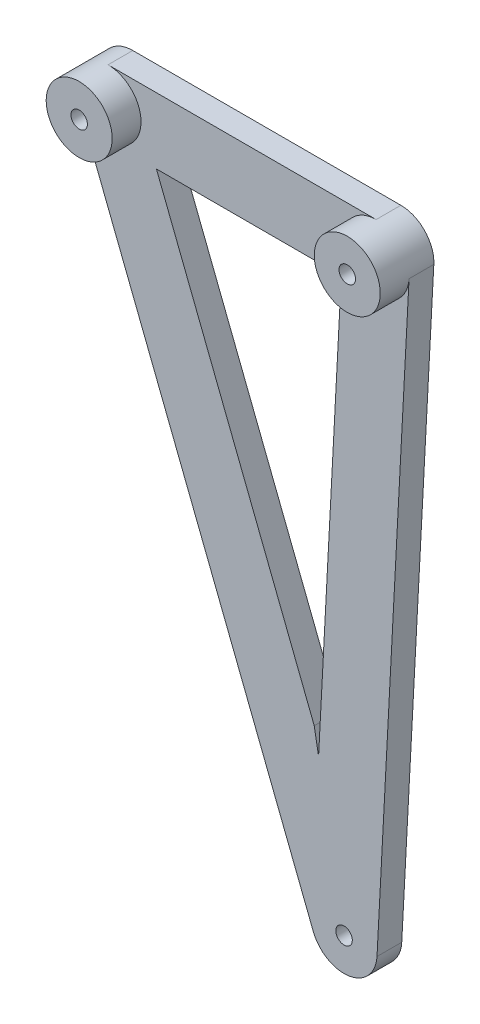
ISO-10303-21;
HEADER;
FILE_DESCRIPTION(('STEP AP214'),'2;1');
FILE_NAME('part.step','',(''),(''),'','','');
FILE_SCHEMA(('AUTOMOTIVE_DESIGN { 1 0 10303 214 1 1 1 1 }'));
ENDSEC;
DATA;
#1=APPLICATION_CONTEXT('core data for automotive mechanical design processes');
#2=APPLICATION_PROTOCOL_DEFINITION('international standard','automotive_design',2000,#1);
#3=PRODUCT_CONTEXT('',#1,'mechanical');
#4=PRODUCT('Part','Part','',(#3));
#5=PRODUCT_RELATED_PRODUCT_CATEGORY('part','',(#4));
#6=PRODUCT_DEFINITION_FORMATION('','',#4);
#7=PRODUCT_DEFINITION_CONTEXT('part definition',#1,'design');
#8=PRODUCT_DEFINITION('design','',#6,#7);
#9=PRODUCT_DEFINITION_SHAPE('','',#8);
#10=(LENGTH_UNIT() NAMED_UNIT(*) SI_UNIT(.MILLI.,.METRE.));
#11=(NAMED_UNIT(*) PLANE_ANGLE_UNIT() SI_UNIT($,.RADIAN.));
#12=(NAMED_UNIT(*) SI_UNIT($,.STERADIAN.) SOLID_ANGLE_UNIT());
#13=UNCERTAINTY_MEASURE_WITH_UNIT(LENGTH_MEASURE(1.E-05),#10,'distance_accuracy_value','');
#14=(GEOMETRIC_REPRESENTATION_CONTEXT(3) GLOBAL_UNCERTAINTY_ASSIGNED_CONTEXT((#13)) GLOBAL_UNIT_ASSIGNED_CONTEXT((#10,
#11,#12)) REPRESENTATION_CONTEXT('',''));
#15=CARTESIAN_POINT('',(0.,0.,0.));
#16=DIRECTION('',(0.,0.,1.));
#17=DIRECTION('',(1.,0.,0.));
#18=AXIS2_PLACEMENT_3D('',#15,#16,#17);
#19=CARTESIAN_POINT('',(0.,0.,3.));
#20=DIRECTION('',(0.,0.,1.));
#21=DIRECTION('',(1.,0.,0.));
#22=AXIS2_PLACEMENT_3D('',#19,#20,#21);
#23=PLANE('',#22);
#24=CARTESIAN_POINT('',(12.361677791994,-101.252384144703,3.));
#25=DIRECTION('',(0.,0.,1.));
#26=DIRECTION('',(1.,0.,0.));
#27=AXIS2_PLACEMENT_3D('',#24,#25,#26);
#28=CIRCLE('',#27,1.);
#29=CARTESIAN_POINT('',(13.361677791994,-101.252384144703,3.));
#30=VERTEX_POINT('',#29);
#31=EDGE_CURVE('E284',#30,#30,#28,.F.);
#32=ORIENTED_EDGE('',*,*,#31,.T.);
#33=EDGE_LOOP('',(#32));
#34=FACE_BOUND('',#33,.T.);
#35=DIRECTION('',(-0.364451968743532,0.931222187492847,0.));
#36=VECTOR('',#35,1.);
#37=CARTESIAN_POINT('',(-19.9189935480802,-7.7956866916289,3.));
#38=LINE('',#37,#36);
#39=CARTESIAN_POINT('',(8.74571225697494,-81.0377386845119,3.));
#40=VERTEX_POINT('',#39);
#41=CARTESIAN_POINT('',(-10.3890916708412,-32.1458256229944,3.));
#42=VERTEX_POINT('',#41);
#43=EDGE_CURVE('E302',#40,#42,#38,.T.);
#44=ORIENTED_EDGE('',*,*,#43,.T.);
#45=DIRECTION('',(1.,0.,0.));
#46=VECTOR('',#45,1.);
#47=CARTESIAN_POINT('',(0.,-32.1458256229944,3.));
#48=LINE('',#47,#46);
#49=CARTESIAN_POINT('',(12.0315980695895,-32.1458256229944,3.));
#50=VERTEX_POINT('',#49);
#51=EDGE_CURVE('E221',#42,#50,#48,.T.);
#52=ORIENTED_EDGE('',*,*,#51,.T.);
#53=DIRECTION('',(0.053111980149802,0.998588562704664,0.));
#54=VECTOR('',#53,1.);
#55=CARTESIAN_POINT('',(13.7025770112592,-0.728799653234533,3.));
#56=LINE('',#55,#54);
#57=CARTESIAN_POINT('',(9.27407890867666,-83.9915125614198,3.));
#58=VERTEX_POINT('',#57);
#59=EDGE_CURVE('E299',#58,#50,#56,.T.);
#60=ORIENTED_EDGE('',*,*,#59,.F.);
#61=DIRECTION('',(-0.176083566882058,0.984375221891577,0.));
#62=VECTOR('',#61,1.);
#63=CARTESIAN_POINT('',(-5.57190989773626,-0.996694905885097,3.));
#64=LINE('',#63,#62);
#65=EDGE_CURVE('E298',#58,#40,#64,.T.);
#66=ORIENTED_EDGE('',*,*,#65,.T.);
#67=EDGE_LOOP('',(#44,#52,#60,#66));
#68=FACE_BOUND('',#67,.T.);
#69=DIRECTION('',(1.,0.,0.));
#70=VECTOR('',#69,1.);
#71=CARTESIAN_POINT('',(0.,-24.1458256229944,3.));
#72=LINE('',#71,#70);
#73=CARTESIAN_POINT('',(-16.2499999999998,-24.1458256229944,3.));
#74=VERTEX_POINT('',#73);
#75=CARTESIAN_POINT('',(16.25,-24.1458256229942,3.));
#76=VERTEX_POINT('',#75);
#77=EDGE_CURVE('E217',#74,#76,#72,.T.);
#78=ORIENTED_EDGE('',*,*,#77,.F.);
#79=CARTESIAN_POINT('',(-16.2499999999998,-28.1458256229944,3.));
#80=DIRECTION('',(0.,0.,1.));
#81=DIRECTION('',(1.,0.,0.));
#82=AXIS2_PLACEMENT_3D('',#79,#80,#81);
#83=CIRCLE('',#82,4.00000000000001);
#84=CARTESIAN_POINT('',(-19.9748887499712,-29.6036334979685,3.));
#85=VERTEX_POINT('',#84);
#86=EDGE_CURVE('E205',#85,#74,#83,.T.);
#87=ORIENTED_EDGE('',*,*,#86,.F.);
#88=DIRECTION('',(-0.364451968743532,0.931222187492847,0.));
#89=VECTOR('',#88,1.);
#90=CARTESIAN_POINT('',(-27.368771048023,-10.7113024415772,3.));
#91=LINE('',#90,#89);
#92=CARTESIAN_POINT('',(8.6367890420226,-102.710192019677,3.));
#93=VERTEX_POINT('',#92);
#94=EDGE_CURVE('E304',#93,#85,#91,.T.);
#95=ORIENTED_EDGE('',*,*,#94,.F.);
#96=CARTESIAN_POINT('',(12.361677791994,-101.252384144703,3.));
#97=DIRECTION('',(0.,0.,1.));
#98=DIRECTION('',(1.,0.,0.));
#99=AXIS2_PLACEMENT_3D('',#96,#97,#98);
#100=CIRCLE('',#99,4.00000000000001);
#101=CARTESIAN_POINT('',(16.3560320428127,-101.464832065302,3.));
#102=VERTEX_POINT('',#101);
#103=EDGE_CURVE('E306',#102,#93,#100,.F.);
#104=ORIENTED_EDGE('',*,*,#103,.F.);
#105=DIRECTION('',(0.053111980149802,0.998588562704664,0.));
#106=VECTOR('',#105,1.);
#107=CARTESIAN_POINT('',(21.6912855128965,-1.15369549443295,3.));
#108=LINE('',#107,#106);
#109=CARTESIAN_POINT('',(20.2443542508187,-28.3582735435935,3.));
#110=VERTEX_POINT('',#109);
#111=EDGE_CURVE('E240',#102,#110,#108,.T.);
#112=ORIENTED_EDGE('',*,*,#111,.T.);
#113=CARTESIAN_POINT('',(16.25,-28.1458256229943,3.));
#114=DIRECTION('',(0.,0.,1.));
#115=DIRECTION('',(1.,0.,0.));
#116=AXIS2_PLACEMENT_3D('',#113,#114,#115);
#117=CIRCLE('',#116,4.00000000000001);
#118=EDGE_CURVE('E225',#76,#110,#117,.T.);
#119=ORIENTED_EDGE('',*,*,#118,.F.);
#120=EDGE_LOOP('',(#78,#87,#95,#104,#112,#119));
#121=FACE_BOUND('',#120,.T.);
#122=ADVANCED_FACE('F127',(#34,#68,#121),#23,.T.);
#123=CARTESIAN_POINT('',(0.,-32.1458256229944,3.));
#124=DIRECTION('',(0.,1.,0.));
#125=DIRECTION('',(0.,0.,1.));
#126=AXIS2_PLACEMENT_3D('',#123,#124,#125);
#127=PLANE('',#126);
#128=DIRECTION('',(0.,0.,-1.));
#129=VECTOR('',#128,1.);
#130=CARTESIAN_POINT('',(-10.3890916708412,-32.1458256229944,89.7772536595407));
#131=LINE('',#130,#129);
#132=CARTESIAN_POINT('',(-10.3890916708412,-32.1458256229944,0.));
#133=VERTEX_POINT('',#132);
#134=EDGE_CURVE('E279',#42,#133,#131,.T.);
#135=ORIENTED_EDGE('',*,*,#134,.T.);
#136=DIRECTION('',(1.,0.,0.));
#137=VECTOR('',#136,1.);
#138=CARTESIAN_POINT('',(0.,-32.1458256229944,0.));
#139=LINE('',#138,#137);
#140=CARTESIAN_POINT('',(12.0315980695895,-32.1458256229944,0.));
#141=VERTEX_POINT('',#140);
#142=EDGE_CURVE('E226',#133,#141,#139,.T.);
#143=ORIENTED_EDGE('',*,*,#142,.T.);
#144=DIRECTION('',(0.,0.,-1.));
#145=VECTOR('',#144,1.);
#146=CARTESIAN_POINT('',(12.0315980695895,-32.1458256229944,89.7772536595407));
#147=LINE('',#146,#145);
#148=EDGE_CURVE('E276',#50,#141,#147,.T.);
#149=ORIENTED_EDGE('',*,*,#148,.F.);
#150=ORIENTED_EDGE('',*,*,#51,.F.);
#151=EDGE_LOOP('',(#135,#143,#149,#150));
#152=FACE_BOUND('',#151,.T.);
#153=ADVANCED_FACE('F330',(#152),#127,.F.);
#154=CARTESIAN_POINT('',(-16.2499999999998,-28.1458256229944,3.));
#155=DIRECTION('',(0.,0.,-1.));
#156=DIRECTION('',(-1.,0.,0.));
#157=AXIS2_PLACEMENT_3D('',#154,#155,#156);
#158=CYLINDRICAL_SURFACE('',#157,4.00000000000001);
#159=DIRECTION('',(0.,0.,-1.));
#160=VECTOR('',#159,1.);
#161=CARTESIAN_POINT('',(-19.9748887499712,-29.6036334979685,89.7772536595407));
#162=LINE('',#161,#160);
#163=CARTESIAN_POINT('',(-19.9748887499712,-29.6036334979685,0.));
#164=VERTEX_POINT('',#163);
#165=EDGE_CURVE('E207',#85,#164,#162,.T.);
#166=ORIENTED_EDGE('',*,*,#165,.F.);
#167=ORIENTED_EDGE('',*,*,#86,.T.);
#168=DIRECTION('',(0.,0.,-1.));
#169=VECTOR('',#168,1.);
#170=CARTESIAN_POINT('',(-16.2499999999998,-24.1458256229944,3.));
#171=LINE('',#170,#169);
#172=CARTESIAN_POINT('',(-16.2499999999998,-24.1458256229944,0.));
#173=VERTEX_POINT('',#172);
#174=EDGE_CURVE('E136',#74,#173,#171,.T.);
#175=ORIENTED_EDGE('',*,*,#174,.T.);
#176=CARTESIAN_POINT('',(-16.2499999999998,-28.1458256229944,0.));
#177=DIRECTION('',(0.,0.,1.));
#178=DIRECTION('',(1.,0.,0.));
#179=AXIS2_PLACEMENT_3D('',#176,#177,#178);
#180=CIRCLE('',#179,4.00000000000001);
#181=EDGE_CURVE('E239',#173,#164,#180,.T.);
#182=ORIENTED_EDGE('',*,*,#181,.T.);
#183=EDGE_LOOP('',(#166,#167,#175,#182));
#184=FACE_BOUND('',#183,.T.);
#185=CARTESIAN_POINT('',(-16.2499999999998,-28.1458256229944,6.5));
#186=DIRECTION('',(0.,0.,1.));
#187=DIRECTION('',(1.,0.,0.));
#188=AXIS2_PLACEMENT_3D('',#185,#186,#187);
#189=CIRCLE('',#188,4.00000000000001);
#190=CARTESIAN_POINT('',(-12.2499999999998,-28.1458256229944,6.5));
#191=VERTEX_POINT('',#190);
#192=EDGE_CURVE('E211',#191,#191,#189,.T.);
#193=ORIENTED_EDGE('',*,*,#192,.F.);
#194=EDGE_LOOP('',(#193));
#195=FACE_BOUND('',#194,.T.);
#196=ADVANCED_FACE('F129',(#184,#195),#158,.T.);
#197=CARTESIAN_POINT('',(0.,-24.1458256229944,3.));
#198=DIRECTION('',(0.,1.,0.));
#199=DIRECTION('',(-1.,0.,0.));
#200=AXIS2_PLACEMENT_3D('',#197,#198,#199);
#201=PLANE('',#200);
#202=DIRECTION('',(1.,0.,0.));
#203=VECTOR('',#202,1.);
#204=CARTESIAN_POINT('',(0.,-24.1458256229944,0.));
#205=LINE('',#204,#203);
#206=CARTESIAN_POINT('',(16.25,-24.1458256229943,0.));
#207=VERTEX_POINT('',#206);
#208=EDGE_CURVE('E220',#173,#207,#205,.T.);
#209=ORIENTED_EDGE('',*,*,#208,.F.);
#210=ORIENTED_EDGE('',*,*,#174,.F.);
#211=ORIENTED_EDGE('',*,*,#77,.T.);
#212=DIRECTION('',(0.,0.,-1.));
#213=VECTOR('',#212,1.);
#214=CARTESIAN_POINT('',(16.25,-24.1458256229943,3.));
#215=LINE('',#214,#213);
#216=EDGE_CURVE('E13',#76,#207,#215,.T.);
#217=ORIENTED_EDGE('',*,*,#216,.T.);
#218=EDGE_LOOP('',(#209,#210,#211,#217));
#219=FACE_BOUND('',#218,.T.);
#220=ADVANCED_FACE('F216',(#219),#201,.T.);
#221=CARTESIAN_POINT('',(0.,0.,0.));
#222=DIRECTION('',(0.,0.,1.));
#223=DIRECTION('',(1.,0.,0.));
#224=AXIS2_PLACEMENT_3D('',#221,#222,#223);
#225=PLANE('',#224);
#226=CARTESIAN_POINT('',(16.25,-28.1458256229943,0.));
#227=DIRECTION('',(0.,0.,1.));
#228=DIRECTION('',(1.,0.,0.));
#229=AXIS2_PLACEMENT_3D('',#226,#227,#228);
#230=CIRCLE('',#229,1.75);
#231=CARTESIAN_POINT('',(18.,-28.1458256229943,0.));
#232=VERTEX_POINT('',#231);
#233=EDGE_CURVE('E248',#232,#232,#230,.T.);
#234=ORIENTED_EDGE('',*,*,#233,.T.);
#235=EDGE_LOOP('',(#234));
#236=FACE_BOUND('',#235,.T.);
#237=CARTESIAN_POINT('',(-16.2499999999998,-28.1458256229944,0.));
#238=DIRECTION('',(0.,0.,1.));
#239=DIRECTION('',(1.,0.,0.));
#240=AXIS2_PLACEMENT_3D('',#237,#238,#239);
#241=CIRCLE('',#240,1.75000000000001);
#242=CARTESIAN_POINT('',(-14.4999999999998,-28.1458256229944,0.));
#243=VERTEX_POINT('',#242);
#244=EDGE_CURVE('E253',#243,#243,#241,.T.);
#245=ORIENTED_EDGE('',*,*,#244,.T.);
#246=EDGE_LOOP('',(#245));
#247=FACE_BOUND('',#246,.T.);
#248=ORIENTED_EDGE('',*,*,#142,.F.);
#249=DIRECTION('',(-0.364451968743532,0.931222187492847,0.));
#250=VECTOR('',#249,1.);
#251=CARTESIAN_POINT('',(-19.9189935480802,-7.7956866916289,0.));
#252=LINE('',#251,#250);
#253=CARTESIAN_POINT('',(8.74571225697494,-81.0377386845119,0.));
#254=VERTEX_POINT('',#253);
#255=EDGE_CURVE('E277',#254,#133,#252,.T.);
#256=ORIENTED_EDGE('',*,*,#255,.F.);
#257=DIRECTION('',(-0.176083566882058,0.984375221891577,0.));
#258=VECTOR('',#257,1.);
#259=CARTESIAN_POINT('',(-5.57190989773626,-0.996694905885097,0.));
#260=LINE('',#259,#258);
#261=CARTESIAN_POINT('',(9.27407890867666,-83.9915125614198,0.));
#262=VERTEX_POINT('',#261);
#263=EDGE_CURVE('E293',#262,#254,#260,.T.);
#264=ORIENTED_EDGE('',*,*,#263,.F.);
#265=DIRECTION('',(0.053111980149802,0.998588562704664,0.));
#266=VECTOR('',#265,1.);
#267=CARTESIAN_POINT('',(13.7025770112592,-0.728799653234533,0.));
#268=LINE('',#267,#266);
#269=EDGE_CURVE('E275',#262,#141,#268,.T.);
#270=ORIENTED_EDGE('',*,*,#269,.T.);
#271=EDGE_LOOP('',(#248,#256,#264,#270));
#272=FACE_BOUND('',#271,.T.);
#273=DIRECTION('',(-0.364451968743532,0.931222187492847,0.));
#274=VECTOR('',#273,1.);
#275=CARTESIAN_POINT('',(-27.368771048023,-10.7113024415772,0.));
#276=LINE('',#275,#274);
#277=CARTESIAN_POINT('',(8.6367890420226,-102.710192019677,0.));
#278=VERTEX_POINT('',#277);
#279=EDGE_CURVE('E281',#278,#164,#276,.T.);
#280=ORIENTED_EDGE('',*,*,#279,.T.);
#281=ORIENTED_EDGE('',*,*,#181,.F.);
#282=ORIENTED_EDGE('',*,*,#208,.T.);
#283=CARTESIAN_POINT('',(16.25,-28.1458256229943,0.));
#284=DIRECTION('',(0.,0.,1.));
#285=DIRECTION('',(1.,0.,0.));
#286=AXIS2_PLACEMENT_3D('',#283,#284,#285);
#287=CIRCLE('',#286,4.);
#288=CARTESIAN_POINT('',(20.2443542508187,-28.3582735435935,0.));
#289=VERTEX_POINT('',#288);
#290=EDGE_CURVE('E236',#289,#207,#287,.T.);
#291=ORIENTED_EDGE('',*,*,#290,.F.);
#292=DIRECTION('',(0.053111980149802,0.998588562704664,0.));
#293=VECTOR('',#292,1.);
#294=CARTESIAN_POINT('',(21.6912855128965,-1.15369549443295,0.));
#295=LINE('',#294,#293);
#296=CARTESIAN_POINT('',(16.3560320428127,-101.464832065302,0.));
#297=VERTEX_POINT('',#296);
#298=EDGE_CURVE('E288',#297,#289,#295,.T.);
#299=ORIENTED_EDGE('',*,*,#298,.F.);
#300=CARTESIAN_POINT('',(12.361677791994,-101.252384144703,0.));
#301=DIRECTION('',(0.,0.,-1.));
#302=DIRECTION('',(-1.,0.,0.));
#303=AXIS2_PLACEMENT_3D('',#300,#301,#302);
#304=CIRCLE('',#303,4.00000000000001);
#305=EDGE_CURVE('E285',#297,#278,#304,.T.);
#306=ORIENTED_EDGE('',*,*,#305,.T.);
#307=EDGE_LOOP('',(#280,#281,#282,#291,#299,#306));
#308=FACE_BOUND('',#307,.T.);
#309=CARTESIAN_POINT('',(12.361677791994,-101.252384144703,0.));
#310=DIRECTION('',(0.,0.,-1.));
#311=DIRECTION('',(-1.,0.,0.));
#312=AXIS2_PLACEMENT_3D('',#309,#310,#311);
#313=CIRCLE('',#312,1.);
#314=CARTESIAN_POINT('',(11.361677791994,-101.252384144703,0.));
#315=VERTEX_POINT('',#314);
#316=EDGE_CURVE('E272',#315,#315,#313,.T.);
#317=ORIENTED_EDGE('',*,*,#316,.F.);
#318=EDGE_LOOP('',(#317));
#319=FACE_BOUND('',#318,.T.);
#320=ADVANCED_FACE('F327',(#236,#247,#272,#308,#319),#225,.F.);
#321=CARTESIAN_POINT('',(-16.2499999999998,-28.1458256229944,3.));
#322=DIRECTION('',(0.,0.,-1.));
#323=DIRECTION('',(-1.,0.,0.));
#324=AXIS2_PLACEMENT_3D('',#321,#322,#323);
#325=CYLINDRICAL_SURFACE('',#324,1.00000000000001);
#326=CARTESIAN_POINT('',(-16.2499999999998,-28.1458256229944,4.5));
#327=DIRECTION('',(0.,0.,1.));
#328=DIRECTION('',(1.,0.,0.));
#329=AXIS2_PLACEMENT_3D('',#326,#327,#328);
#330=CIRCLE('',#329,1.00000000000001);
#331=CARTESIAN_POINT('',(-15.2499999999998,-28.1458256229944,4.5));
#332=VERTEX_POINT('',#331);
#333=EDGE_CURVE('E131',#332,#332,#330,.T.);
#334=ORIENTED_EDGE('',*,*,#333,.F.);
#335=EDGE_LOOP('',(#334));
#336=FACE_BOUND('',#335,.T.);
#337=CARTESIAN_POINT('',(-16.2499999999998,-28.1458256229944,6.5));
#338=DIRECTION('',(0.,0.,1.));
#339=DIRECTION('',(1.,0.,0.));
#340=AXIS2_PLACEMENT_3D('',#337,#338,#339);
#341=CIRCLE('',#340,1.00000000000001);
#342=CARTESIAN_POINT('',(-15.2499999999998,-28.1458256229944,6.5));
#343=VERTEX_POINT('',#342);
#344=EDGE_CURVE('E212',#343,#343,#341,.T.);
#345=ORIENTED_EDGE('',*,*,#344,.T.);
#346=EDGE_LOOP('',(#345));
#347=FACE_BOUND('',#346,.T.);
#348=ADVANCED_FACE('F352',(#336,#347),#325,.F.);
#349=CARTESIAN_POINT('',(16.25,-28.1458256229943,3.));
#350=DIRECTION('',(0.,0.,-1.));
#351=DIRECTION('',(-1.,0.,0.));
#352=AXIS2_PLACEMENT_3D('',#349,#350,#351);
#353=CYLINDRICAL_SURFACE('',#352,0.999999999999998);
#354=CARTESIAN_POINT('',(16.25,-28.1458256229943,4.5));
#355=DIRECTION('',(0.,0.,1.));
#356=DIRECTION('',(1.,0.,0.));
#357=AXIS2_PLACEMENT_3D('',#354,#355,#356);
#358=CIRCLE('',#357,0.999999999999998);
#359=CARTESIAN_POINT('',(17.25,-28.1458256229943,4.5));
#360=VERTEX_POINT('',#359);
#361=EDGE_CURVE('E241',#360,#360,#358,.T.);
#362=ORIENTED_EDGE('',*,*,#361,.F.);
#363=EDGE_LOOP('',(#362));
#364=FACE_BOUND('',#363,.T.);
#365=CARTESIAN_POINT('',(16.25,-28.1458256229943,6.5));
#366=DIRECTION('',(0.,0.,1.));
#367=DIRECTION('',(1.,0.,0.));
#368=AXIS2_PLACEMENT_3D('',#365,#366,#367);
#369=CIRCLE('',#368,0.999999999999998);
#370=CARTESIAN_POINT('',(17.25,-28.1458256229943,6.5));
#371=VERTEX_POINT('',#370);
#372=EDGE_CURVE('E264',#371,#371,#369,.T.);
#373=ORIENTED_EDGE('',*,*,#372,.T.);
#374=EDGE_LOOP('',(#373));
#375=FACE_BOUND('',#374,.T.);
#376=ADVANCED_FACE('F357',(#364,#375),#353,.F.);
#377=CARTESIAN_POINT('',(16.25,-28.1458256229943,3.));
#378=DIRECTION('',(0.,0.,-1.));
#379=DIRECTION('',(-1.,0.,0.));
#380=AXIS2_PLACEMENT_3D('',#377,#378,#379);
#381=CYLINDRICAL_SURFACE('',#380,4.);
#382=ORIENTED_EDGE('',*,*,#216,.F.);
#383=ORIENTED_EDGE('',*,*,#118,.T.);
#384=DIRECTION('',(0.,0.,-1.));
#385=VECTOR('',#384,1.);
#386=CARTESIAN_POINT('',(20.2443542508187,-28.3582735435935,89.7772536595407));
#387=LINE('',#386,#385);
#388=EDGE_CURVE('E144',#110,#289,#387,.T.);
#389=ORIENTED_EDGE('',*,*,#388,.T.);
#390=ORIENTED_EDGE('',*,*,#290,.T.);
#391=EDGE_LOOP('',(#382,#383,#389,#390));
#392=FACE_BOUND('',#391,.T.);
#393=CARTESIAN_POINT('',(16.25,-28.1458256229943,6.5));
#394=DIRECTION('',(0.,0.,1.));
#395=DIRECTION('',(1.,0.,0.));
#396=AXIS2_PLACEMENT_3D('',#393,#394,#395);
#397=CIRCLE('',#396,4.00000000000001);
#398=CARTESIAN_POINT('',(20.25,-28.1458256229943,6.5));
#399=VERTEX_POINT('',#398);
#400=EDGE_CURVE('E268',#399,#399,#397,.T.);
#401=ORIENTED_EDGE('',*,*,#400,.F.);
#402=EDGE_LOOP('',(#401));
#403=FACE_BOUND('',#402,.T.);
#404=ADVANCED_FACE('F360',(#392,#403),#381,.T.);
#405=CARTESIAN_POINT('',(-5.57190989773626,-0.996694905885097,89.7772536595407));
#406=DIRECTION('',(-0.984375221891577,-0.176083566882058,0.));
#407=DIRECTION('',(0.176083566882058,-0.984375221891577,0.));
#408=AXIS2_PLACEMENT_3D('',#405,#406,#407);
#409=PLANE('',#408);
#410=ORIENTED_EDGE('',*,*,#65,.F.);
#411=DIRECTION('',(0.,0.,-1.));
#412=VECTOR('',#411,1.);
#413=CARTESIAN_POINT('',(9.27407890867666,-83.9915125614198,89.7772536595407));
#414=LINE('',#413,#412);
#415=EDGE_CURVE('E233',#58,#262,#414,.T.);
#416=ORIENTED_EDGE('',*,*,#415,.T.);
#417=ORIENTED_EDGE('',*,*,#263,.T.);
#418=DIRECTION('',(0.,0.,-1.));
#419=VECTOR('',#418,1.);
#420=CARTESIAN_POINT('',(8.74571225697494,-81.0377386845119,89.7772536595407));
#421=LINE('',#420,#419);
#422=EDGE_CURVE('E280',#40,#254,#421,.T.);
#423=ORIENTED_EDGE('',*,*,#422,.F.);
#424=EDGE_LOOP('',(#410,#416,#417,#423));
#425=FACE_BOUND('',#424,.T.);
#426=ADVANCED_FACE('F338',(#425),#409,.F.);
#427=CARTESIAN_POINT('',(-19.9189935480802,-7.7956866916289,89.7772536595407));
#428=DIRECTION('',(-0.931222187492847,-0.364451968743532,0.));
#429=DIRECTION('',(0.364451968743532,-0.931222187492847,0.));
#430=AXIS2_PLACEMENT_3D('',#427,#428,#429);
#431=PLANE('',#430);
#432=ORIENTED_EDGE('',*,*,#43,.F.);
#433=ORIENTED_EDGE('',*,*,#422,.T.);
#434=ORIENTED_EDGE('',*,*,#255,.T.);
#435=ORIENTED_EDGE('',*,*,#134,.F.);
#436=EDGE_LOOP('',(#432,#433,#434,#435));
#437=FACE_BOUND('',#436,.T.);
#438=ADVANCED_FACE('F334',(#437),#431,.F.);
#439=CARTESIAN_POINT('',(-27.368771048023,-10.7113024415772,89.7772536595407));
#440=DIRECTION('',(-0.931222187492847,-0.364451968743532,0.));
#441=DIRECTION('',(0.364451968743532,-0.931222187492847,0.));
#442=AXIS2_PLACEMENT_3D('',#439,#440,#441);
#443=PLANE('',#442);
#444=DIRECTION('',(0.,0.,-1.));
#445=VECTOR('',#444,1.);
#446=CARTESIAN_POINT('',(8.6367890420226,-102.710192019677,89.7772536595407));
#447=LINE('',#446,#445);
#448=EDGE_CURVE('E309',#93,#278,#447,.T.);
#449=ORIENTED_EDGE('',*,*,#448,.F.);
#450=ORIENTED_EDGE('',*,*,#94,.T.);
#451=ORIENTED_EDGE('',*,*,#165,.T.);
#452=ORIENTED_EDGE('',*,*,#279,.F.);
#453=EDGE_LOOP('',(#449,#450,#451,#452));
#454=FACE_BOUND('',#453,.T.);
#455=ADVANCED_FACE('F399',(#454),#443,.T.);
#456=CARTESIAN_POINT('',(12.361677791994,-101.252384144703,89.7772536595407));
#457=DIRECTION('',(0.,0.,-1.));
#458=DIRECTION('',(-1.,0.,0.));
#459=AXIS2_PLACEMENT_3D('',#456,#457,#458);
#460=CYLINDRICAL_SURFACE('',#459,4.00000000000001);
#461=DIRECTION('',(0.,0.,-1.));
#462=VECTOR('',#461,1.);
#463=CARTESIAN_POINT('',(16.3560320428127,-101.464832065302,89.7772536595407));
#464=LINE('',#463,#462);
#465=EDGE_CURVE('E290',#102,#297,#464,.T.);
#466=ORIENTED_EDGE('',*,*,#465,.F.);
#467=ORIENTED_EDGE('',*,*,#103,.T.);
#468=ORIENTED_EDGE('',*,*,#448,.T.);
#469=ORIENTED_EDGE('',*,*,#305,.F.);
#470=EDGE_LOOP('',(#466,#467,#468,#469));
#471=FACE_BOUND('',#470,.T.);
#472=ADVANCED_FACE('F396',(#471),#460,.T.);
#473=CARTESIAN_POINT('',(21.6912855128965,-1.15369549443295,89.7772536595407));
#474=DIRECTION('',(-0.998588562704664,0.0531119801498019,0.));
#475=DIRECTION('',(-0.053111980149802,-0.998588562704664,0.));
#476=AXIS2_PLACEMENT_3D('',#473,#474,#475);
#477=PLANE('',#476);
#478=ORIENTED_EDGE('',*,*,#111,.F.);
#479=ORIENTED_EDGE('',*,*,#465,.T.);
#480=ORIENTED_EDGE('',*,*,#298,.T.);
#481=ORIENTED_EDGE('',*,*,#388,.F.);
#482=EDGE_LOOP('',(#478,#479,#480,#481));
#483=FACE_BOUND('',#482,.T.);
#484=ADVANCED_FACE('F393',(#483),#477,.F.);
#485=CARTESIAN_POINT('',(13.7025770112592,-0.728799653234533,89.7772536595407));
#486=DIRECTION('',(-0.998588562704664,0.053111980149802,0.));
#487=DIRECTION('',(-0.053111980149802,-0.998588562704664,0.));
#488=AXIS2_PLACEMENT_3D('',#485,#486,#487);
#489=PLANE('',#488);
#490=ORIENTED_EDGE('',*,*,#415,.F.);
#491=ORIENTED_EDGE('',*,*,#59,.T.);
#492=ORIENTED_EDGE('',*,*,#148,.T.);
#493=ORIENTED_EDGE('',*,*,#269,.F.);
#494=EDGE_LOOP('',(#490,#491,#492,#493));
#495=FACE_BOUND('',#494,.T.);
#496=ADVANCED_FACE('F321',(#495),#489,.T.);
#497=CARTESIAN_POINT('',(12.361677791994,-101.252384144703,89.7772536595407));
#498=DIRECTION('',(0.,0.,-1.));
#499=DIRECTION('',(-1.,0.,0.));
#500=AXIS2_PLACEMENT_3D('',#497,#498,#499);
#501=CYLINDRICAL_SURFACE('',#500,1.);
#502=ORIENTED_EDGE('',*,*,#316,.T.);
#503=EDGE_LOOP('',(#502));
#504=FACE_BOUND('',#503,.T.);
#505=ORIENTED_EDGE('',*,*,#31,.F.);
#506=EDGE_LOOP('',(#505));
#507=FACE_BOUND('',#506,.T.);
#508=ADVANCED_FACE('F349',(#504,#507),#501,.F.);
#509=CARTESIAN_POINT('',(16.25,-28.1458256229943,6.5));
#510=DIRECTION('',(0.,0.,1.));
#511=DIRECTION('',(1.,0.,0.));
#512=AXIS2_PLACEMENT_3D('',#509,#510,#511);
#513=PLANE('',#512);
#514=ORIENTED_EDGE('',*,*,#400,.T.);
#515=EDGE_LOOP('',(#514));
#516=FACE_BOUND('',#515,.T.);
#517=ORIENTED_EDGE('',*,*,#372,.F.);
#518=EDGE_LOOP('',(#517));
#519=FACE_BOUND('',#518,.T.);
#520=ADVANCED_FACE('F375',(#516,#519),#513,.T.);
#521=CARTESIAN_POINT('',(-16.2499999999998,-28.1458256229944,6.5));
#522=DIRECTION('',(0.,0.,1.));
#523=DIRECTION('',(1.,0.,0.));
#524=AXIS2_PLACEMENT_3D('',#521,#522,#523);
#525=PLANE('',#524);
#526=ORIENTED_EDGE('',*,*,#192,.T.);
#527=EDGE_LOOP('',(#526));
#528=FACE_BOUND('',#527,.T.);
#529=ORIENTED_EDGE('',*,*,#344,.F.);
#530=EDGE_LOOP('',(#529));
#531=FACE_BOUND('',#530,.T.);
#532=ADVANCED_FACE('F372',(#528,#531),#525,.T.);
#533=CARTESIAN_POINT('',(16.25,-28.1458256229943,11.4497474683058));
#534=DIRECTION('',(0.,0.,-1.));
#535=DIRECTION('',(-1.,0.,0.));
#536=AXIS2_PLACEMENT_3D('',#533,#534,#535);
#537=CYLINDRICAL_SURFACE('',#536,1.75);
#538=ORIENTED_EDGE('',*,*,#233,.F.);
#539=EDGE_LOOP('',(#538));
#540=FACE_BOUND('',#539,.T.);
#541=CARTESIAN_POINT('',(16.25,-28.1458256229943,4.5));
#542=DIRECTION('',(0.,0.,1.));
#543=DIRECTION('',(1.,0.,0.));
#544=AXIS2_PLACEMENT_3D('',#541,#542,#543);
#545=CIRCLE('',#544,1.75);
#546=CARTESIAN_POINT('',(18.,-28.1458256229943,4.5));
#547=VERTEX_POINT('',#546);
#548=EDGE_CURVE('E243',#547,#547,#545,.T.);
#549=ORIENTED_EDGE('',*,*,#548,.T.);
#550=EDGE_LOOP('',(#549));
#551=FACE_BOUND('',#550,.T.);
#552=ADVANCED_FACE('F374',(#540,#551),#537,.F.);
#553=CARTESIAN_POINT('',(16.25,-28.1458256229943,4.5));
#554=DIRECTION('',(0.,0.,1.));
#555=DIRECTION('',(1.,0.,0.));
#556=AXIS2_PLACEMENT_3D('',#553,#554,#555);
#557=PLANE('',#556);
#558=ORIENTED_EDGE('',*,*,#361,.T.);
#559=EDGE_LOOP('',(#558));
#560=FACE_BOUND('',#559,.T.);
#561=ORIENTED_EDGE('',*,*,#548,.F.);
#562=EDGE_LOOP('',(#561));
#563=FACE_BOUND('',#562,.T.);
#564=ADVANCED_FACE('F382',(#560,#563),#557,.F.);
#565=CARTESIAN_POINT('',(-16.2499999999998,-28.1458256229944,11.4497474683058));
#566=DIRECTION('',(0.,0.,-1.));
#567=DIRECTION('',(-1.,0.,0.));
#568=AXIS2_PLACEMENT_3D('',#565,#566,#567);
#569=CYLINDRICAL_SURFACE('',#568,1.75000000000001);
#570=ORIENTED_EDGE('',*,*,#244,.F.);
#571=EDGE_LOOP('',(#570));
#572=FACE_BOUND('',#571,.T.);
#573=CARTESIAN_POINT('',(-16.2499999999998,-28.1458256229944,4.5));
#574=DIRECTION('',(0.,0.,1.));
#575=DIRECTION('',(1.,0.,0.));
#576=AXIS2_PLACEMENT_3D('',#573,#574,#575);
#577=CIRCLE('',#576,1.75000000000001);
#578=CARTESIAN_POINT('',(-14.4999999999998,-28.1458256229944,4.5));
#579=VERTEX_POINT('',#578);
#580=EDGE_CURVE('E256',#579,#579,#577,.T.);
#581=ORIENTED_EDGE('',*,*,#580,.T.);
#582=EDGE_LOOP('',(#581));
#583=FACE_BOUND('',#582,.T.);
#584=ADVANCED_FACE('F388',(#572,#583),#569,.F.);
#585=CARTESIAN_POINT('',(16.25,-28.1458256229943,4.5));
#586=DIRECTION('',(0.,0.,1.));
#587=DIRECTION('',(1.,0.,0.));
#588=AXIS2_PLACEMENT_3D('',#585,#586,#587);
#589=PLANE('',#588);
#590=ORIENTED_EDGE('',*,*,#333,.T.);
#591=EDGE_LOOP('',(#590));
#592=FACE_BOUND('',#591,.T.);
#593=ORIENTED_EDGE('',*,*,#580,.F.);
#594=EDGE_LOOP('',(#593));
#595=FACE_BOUND('',#594,.T.);
#596=ADVANCED_FACE('F493',(#592,#595),#589,.F.);
#597=CLOSED_SHELL('',(#122,#153,#196,#220,#320,#348,#376,#404,#426,#438,#455,#472,#484,#496,
#508,#520,#532,#552,#564,#584,#596));
#598=MANIFOLD_SOLID_BREP('B2',#597);
#599=ADVANCED_BREP_SHAPE_REPRESENTATION('',(#18,#598),#14);
#600=SHAPE_DEFINITION_REPRESENTATION(#9,#599);
ENDSEC;
END-ISO-10303-21;
